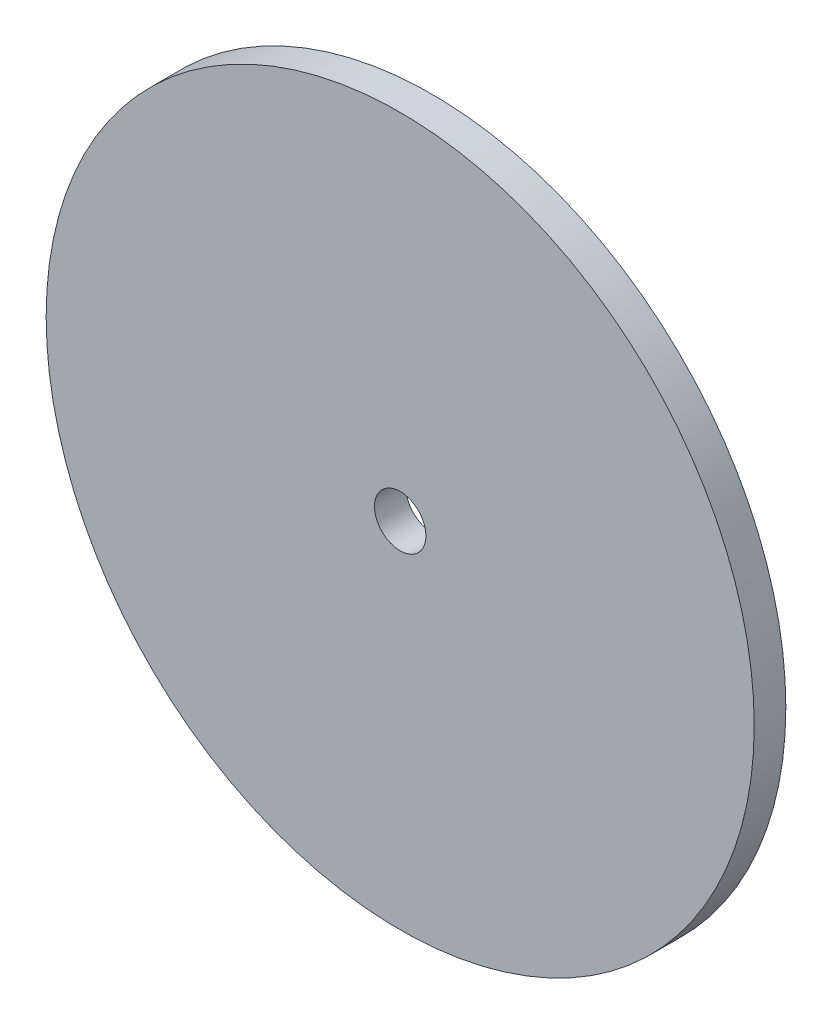
ISO-10303-21;
HEADER;
FILE_DESCRIPTION(('STEP AP214'),'2;1');
FILE_NAME('part.step','',(''),(''),'','','');
FILE_SCHEMA(('AUTOMOTIVE_DESIGN { 1 0 10303 214 1 1 1 1 }'));
ENDSEC;
DATA;
#1=APPLICATION_CONTEXT('core data for automotive mechanical design processes');
#2=APPLICATION_PROTOCOL_DEFINITION('international standard','automotive_design',2000,#1);
#3=PRODUCT_CONTEXT('',#1,'mechanical');
#4=PRODUCT('Part','Part','',(#3));
#5=PRODUCT_RELATED_PRODUCT_CATEGORY('part','',(#4));
#6=PRODUCT_DEFINITION_FORMATION('','',#4);
#7=PRODUCT_DEFINITION_CONTEXT('part definition',#1,'design');
#8=PRODUCT_DEFINITION('design','',#6,#7);
#9=PRODUCT_DEFINITION_SHAPE('','',#8);
#10=(LENGTH_UNIT() NAMED_UNIT(*) SI_UNIT(.MILLI.,.METRE.));
#11=(NAMED_UNIT(*) PLANE_ANGLE_UNIT() SI_UNIT($,.RADIAN.));
#12=(NAMED_UNIT(*) SI_UNIT($,.STERADIAN.) SOLID_ANGLE_UNIT());
#13=UNCERTAINTY_MEASURE_WITH_UNIT(LENGTH_MEASURE(1.E-05),#10,'distance_accuracy_value','');
#14=(GEOMETRIC_REPRESENTATION_CONTEXT(3) GLOBAL_UNCERTAINTY_ASSIGNED_CONTEXT((#13)) GLOBAL_UNIT_ASSIGNED_CONTEXT((#10,
#11,#12)) REPRESENTATION_CONTEXT('',''));
#15=CARTESIAN_POINT('',(0.,0.,0.));
#16=DIRECTION('',(0.,0.,1.));
#17=DIRECTION('',(1.,0.,0.));
#18=AXIS2_PLACEMENT_3D('',#15,#16,#17);
#19=CARTESIAN_POINT('',(-72.3348449074024,41.07755868597,3.175));
#20=DIRECTION('',(0.,0.,1.));
#21=DIRECTION('',(1.,0.,0.));
#22=AXIS2_PLACEMENT_3D('',#19,#20,#21);
#23=PLANE('',#22);
#24=CARTESIAN_POINT('',(-72.3348449074024,41.07755868597,3.175));
#25=DIRECTION('',(0.,0.,1.));
#26=DIRECTION('',(1.,0.,0.));
#27=AXIS2_PLACEMENT_3D('',#24,#25,#26);
#28=CIRCLE('',#27,35.56);
#29=CARTESIAN_POINT('',(-36.7748449074024,41.07755868597,3.175));
#30=VERTEX_POINT('',#29);
#31=EDGE_CURVE('E10',#30,#30,#28,.T.);
#32=ORIENTED_EDGE('',*,*,#31,.T.);
#33=EDGE_LOOP('',(#32));
#34=FACE_BOUND('',#33,.T.);
#35=CARTESIAN_POINT('',(-72.3348449074024,41.07755868597,3.175));
#36=DIRECTION('',(0.,0.,1.));
#37=DIRECTION('',(1.,0.,0.));
#38=AXIS2_PLACEMENT_3D('',#35,#36,#37);
#39=CIRCLE('',#38,2.5828);
#40=CARTESIAN_POINT('',(-69.7520449074024,41.07755868597,3.175));
#41=VERTEX_POINT('',#40);
#42=EDGE_CURVE('E42',#41,#41,#39,.T.);
#43=ORIENTED_EDGE('',*,*,#42,.F.);
#44=EDGE_LOOP('',(#43));
#45=FACE_BOUND('',#44,.T.);
#46=ADVANCED_FACE('F31',(#34,#45),#23,.T.);
#47=CARTESIAN_POINT('',(-72.3348449074024,41.07755868597,0.));
#48=DIRECTION('',(0.,0.,1.));
#49=DIRECTION('',(1.,0.,0.));
#50=AXIS2_PLACEMENT_3D('',#47,#48,#49);
#51=PLANE('',#50);
#52=CARTESIAN_POINT('',(-72.3348449074024,41.07755868597,0.));
#53=DIRECTION('',(0.,0.,1.));
#54=DIRECTION('',(1.,0.,0.));
#55=AXIS2_PLACEMENT_3D('',#52,#53,#54);
#56=CIRCLE('',#55,35.56);
#57=CARTESIAN_POINT('',(-36.7748449074024,41.07755868597,0.));
#58=VERTEX_POINT('',#57);
#59=EDGE_CURVE('E35',#58,#58,#56,.T.);
#60=ORIENTED_EDGE('',*,*,#59,.F.);
#61=EDGE_LOOP('',(#60));
#62=FACE_BOUND('',#61,.T.);
#63=CARTESIAN_POINT('',(-72.3348449074024,41.07755868597,0.));
#64=DIRECTION('',(0.,0.,1.));
#65=DIRECTION('',(1.,0.,0.));
#66=AXIS2_PLACEMENT_3D('',#63,#64,#65);
#67=CIRCLE('',#66,2.5828);
#68=CARTESIAN_POINT('',(-69.7520449074024,41.07755868597,0.));
#69=VERTEX_POINT('',#68);
#70=EDGE_CURVE('E44',#69,#69,#67,.T.);
#71=ORIENTED_EDGE('',*,*,#70,.T.);
#72=EDGE_LOOP('',(#71));
#73=FACE_BOUND('',#72,.T.);
#74=ADVANCED_FACE('F54',(#62,#73),#51,.F.);
#75=CARTESIAN_POINT('',(-72.3348449074024,41.07755868597,3.175));
#76=DIRECTION('',(0.,0.,-1.));
#77=DIRECTION('',(-1.,0.,0.));
#78=AXIS2_PLACEMENT_3D('',#75,#76,#77);
#79=CYLINDRICAL_SURFACE('',#78,35.56);
#80=ORIENTED_EDGE('',*,*,#31,.F.);
#81=EDGE_LOOP('',(#80));
#82=FACE_BOUND('',#81,.T.);
#83=ORIENTED_EDGE('',*,*,#59,.T.);
#84=EDGE_LOOP('',(#83));
#85=FACE_BOUND('',#84,.T.);
#86=ADVANCED_FACE('F33',(#82,#85),#79,.T.);
#87=CARTESIAN_POINT('',(-72.3348449074024,41.07755868597,3.175));
#88=DIRECTION('',(0.,0.,-1.));
#89=DIRECTION('',(-1.,0.,0.));
#90=AXIS2_PLACEMENT_3D('',#87,#88,#89);
#91=CYLINDRICAL_SURFACE('',#90,2.5828);
#92=ORIENTED_EDGE('',*,*,#42,.T.);
#93=EDGE_LOOP('',(#92));
#94=FACE_BOUND('',#93,.T.);
#95=ORIENTED_EDGE('',*,*,#70,.F.);
#96=EDGE_LOOP('',(#95));
#97=FACE_BOUND('',#96,.T.);
#98=ADVANCED_FACE('F50',(#94,#97),#91,.F.);
#99=CLOSED_SHELL('',(#46,#74,#86,#98));
#100=MANIFOLD_SOLID_BREP('B2',#99);
#101=ADVANCED_BREP_SHAPE_REPRESENTATION('',(#18,#100),#14);
#102=SHAPE_DEFINITION_REPRESENTATION(#9,#101);
ENDSEC;
END-ISO-10303-21;
